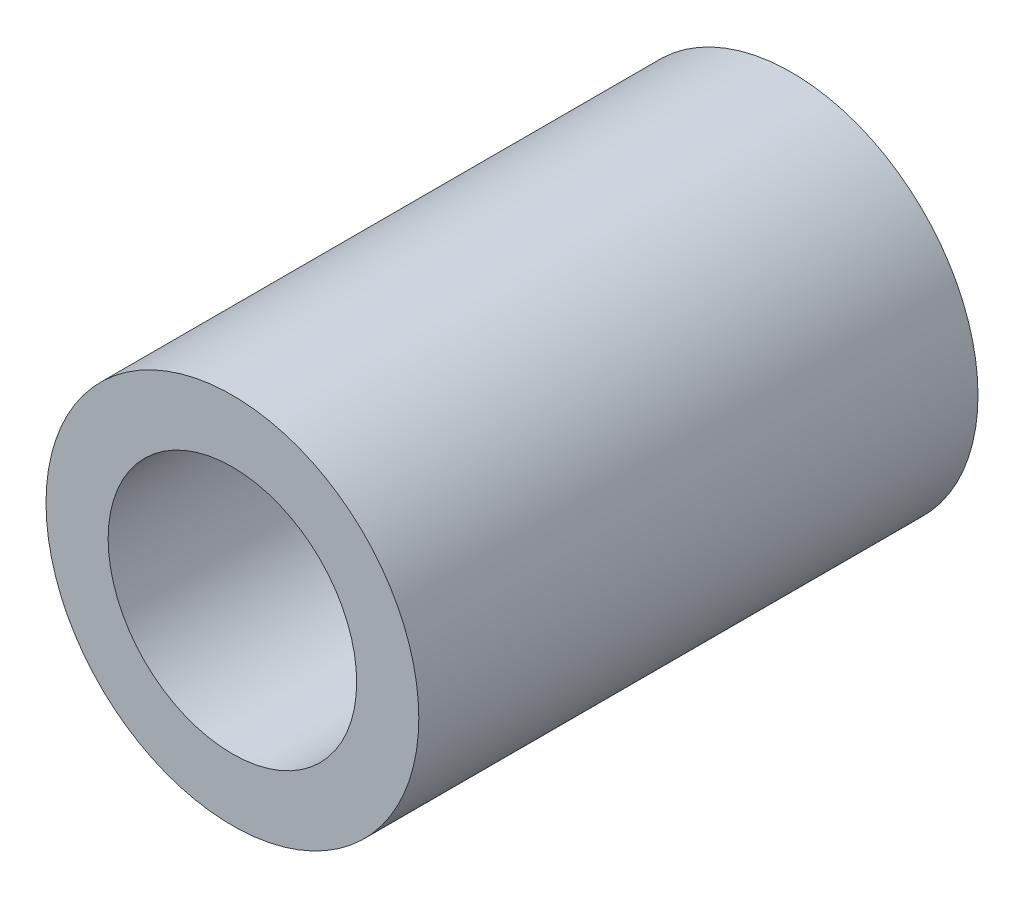
ISO-10303-21;
HEADER;
FILE_DESCRIPTION(('STEP AP214'),'2;1');
FILE_NAME('part.step','',(''),(''),'','','');
FILE_SCHEMA(('AUTOMOTIVE_DESIGN { 1 0 10303 214 1 1 1 1 }'));
ENDSEC;
DATA;
#1=APPLICATION_CONTEXT('core data for automotive mechanical design processes');
#2=APPLICATION_PROTOCOL_DEFINITION('international standard','automotive_design',2000,#1);
#3=PRODUCT_CONTEXT('',#1,'mechanical');
#4=PRODUCT('Part','Part','',(#3));
#5=PRODUCT_RELATED_PRODUCT_CATEGORY('part','',(#4));
#6=PRODUCT_DEFINITION_FORMATION('','',#4);
#7=PRODUCT_DEFINITION_CONTEXT('part definition',#1,'design');
#8=PRODUCT_DEFINITION('design','',#6,#7);
#9=PRODUCT_DEFINITION_SHAPE('','',#8);
#10=(LENGTH_UNIT() NAMED_UNIT(*) SI_UNIT(.MILLI.,.METRE.));
#11=(NAMED_UNIT(*) PLANE_ANGLE_UNIT() SI_UNIT($,.RADIAN.));
#12=(NAMED_UNIT(*) SI_UNIT($,.STERADIAN.) SOLID_ANGLE_UNIT());
#13=UNCERTAINTY_MEASURE_WITH_UNIT(LENGTH_MEASURE(1.E-05),#10,'distance_accuracy_value','');
#14=(GEOMETRIC_REPRESENTATION_CONTEXT(3) GLOBAL_UNCERTAINTY_ASSIGNED_CONTEXT((#13)) GLOBAL_UNIT_ASSIGNED_CONTEXT((#10,
#11,#12)) REPRESENTATION_CONTEXT('',''));
#15=CARTESIAN_POINT('',(0.,0.,0.));
#16=DIRECTION('',(0.,0.,1.));
#17=DIRECTION('',(1.,0.,0.));
#18=AXIS2_PLACEMENT_3D('',#15,#16,#17);
#19=CARTESIAN_POINT('',(0.,0.,7.14375));
#20=DIRECTION('',(0.,0.,1.));
#21=DIRECTION('',(1.,0.,0.));
#22=AXIS2_PLACEMENT_3D('',#19,#20,#21);
#23=PLANE('',#22);
#24=CARTESIAN_POINT('',(0.,0.,7.14375));
#25=DIRECTION('',(0.,0.,1.));
#26=DIRECTION('',(1.,0.,0.));
#27=AXIS2_PLACEMENT_3D('',#24,#25,#26);
#28=CIRCLE('',#27,2.38125);
#29=CARTESIAN_POINT('',(2.38125,0.,7.14375));
#30=VERTEX_POINT('',#29);
#31=EDGE_CURVE('E10',#30,#30,#28,.T.);
#32=ORIENTED_EDGE('',*,*,#31,.T.);
#33=EDGE_LOOP('',(#32));
#34=FACE_BOUND('',#33,.T.);
#35=CARTESIAN_POINT('',(0.,0.,7.14375));
#36=DIRECTION('',(0.,0.,1.));
#37=DIRECTION('',(1.,0.,0.));
#38=AXIS2_PLACEMENT_3D('',#35,#36,#37);
#39=CIRCLE('',#38,1.5875);
#40=CARTESIAN_POINT('',(1.5875,0.,7.14375));
#41=VERTEX_POINT('',#40);
#42=EDGE_CURVE('E56',#41,#41,#39,.T.);
#43=ORIENTED_EDGE('',*,*,#42,.F.);
#44=EDGE_LOOP('',(#43));
#45=FACE_BOUND('',#44,.T.);
#46=ADVANCED_FACE('F43',(#34,#45),#23,.T.);
#47=CARTESIAN_POINT('',(0.,0.,0.));
#48=DIRECTION('',(0.,0.,1.));
#49=DIRECTION('',(1.,0.,0.));
#50=AXIS2_PLACEMENT_3D('',#47,#48,#49);
#51=PLANE('',#50);
#52=CARTESIAN_POINT('',(0.,0.,0.));
#53=DIRECTION('',(0.,0.,1.));
#54=DIRECTION('',(1.,0.,0.));
#55=AXIS2_PLACEMENT_3D('',#52,#53,#54);
#56=CIRCLE('',#55,2.38125);
#57=CARTESIAN_POINT('',(2.38125,0.,0.));
#58=VERTEX_POINT('',#57);
#59=EDGE_CURVE('E47',#58,#58,#56,.T.);
#60=ORIENTED_EDGE('',*,*,#59,.F.);
#61=EDGE_LOOP('',(#60));
#62=FACE_BOUND('',#61,.T.);
#63=CARTESIAN_POINT('',(0.,0.,0.));
#64=DIRECTION('',(0.,0.,1.));
#65=DIRECTION('',(1.,0.,0.));
#66=AXIS2_PLACEMENT_3D('',#63,#64,#65);
#67=CIRCLE('',#66,1.5875);
#68=CARTESIAN_POINT('',(1.5875,0.,0.));
#69=VERTEX_POINT('',#68);
#70=EDGE_CURVE('E58',#69,#69,#67,.T.);
#71=ORIENTED_EDGE('',*,*,#70,.T.);
#72=EDGE_LOOP('',(#71));
#73=FACE_BOUND('',#72,.T.);
#74=ADVANCED_FACE('F70',(#62,#73),#51,.F.);
#75=CARTESIAN_POINT('',(0.,0.,7.14375));
#76=DIRECTION('',(0.,0.,-1.));
#77=DIRECTION('',(-1.,0.,0.));
#78=AXIS2_PLACEMENT_3D('',#75,#76,#77);
#79=CYLINDRICAL_SURFACE('',#78,2.38125);
#80=ORIENTED_EDGE('',*,*,#31,.F.);
#81=EDGE_LOOP('',(#80));
#82=FACE_BOUND('',#81,.T.);
#83=ORIENTED_EDGE('',*,*,#59,.T.);
#84=EDGE_LOOP('',(#83));
#85=FACE_BOUND('',#84,.T.);
#86=ADVANCED_FACE('F45',(#82,#85),#79,.T.);
#87=CARTESIAN_POINT('',(0.,0.,7.14375));
#88=DIRECTION('',(0.,0.,-1.));
#89=DIRECTION('',(-1.,0.,0.));
#90=AXIS2_PLACEMENT_3D('',#87,#88,#89);
#91=CYLINDRICAL_SURFACE('',#90,1.5875);
#92=ORIENTED_EDGE('',*,*,#42,.T.);
#93=EDGE_LOOP('',(#92));
#94=FACE_BOUND('',#93,.T.);
#95=ORIENTED_EDGE('',*,*,#70,.F.);
#96=EDGE_LOOP('',(#95));
#97=FACE_BOUND('',#96,.T.);
#98=ADVANCED_FACE('F66',(#94,#97),#91,.F.);
#99=CLOSED_SHELL('',(#46,#74,#86,#98));
#100=MANIFOLD_SOLID_BREP('B2',#99);
#101=ADVANCED_BREP_SHAPE_REPRESENTATION('',(#18,#100),#14);
#102=SHAPE_DEFINITION_REPRESENTATION(#9,#101);
ENDSEC;
END-ISO-10303-21;
